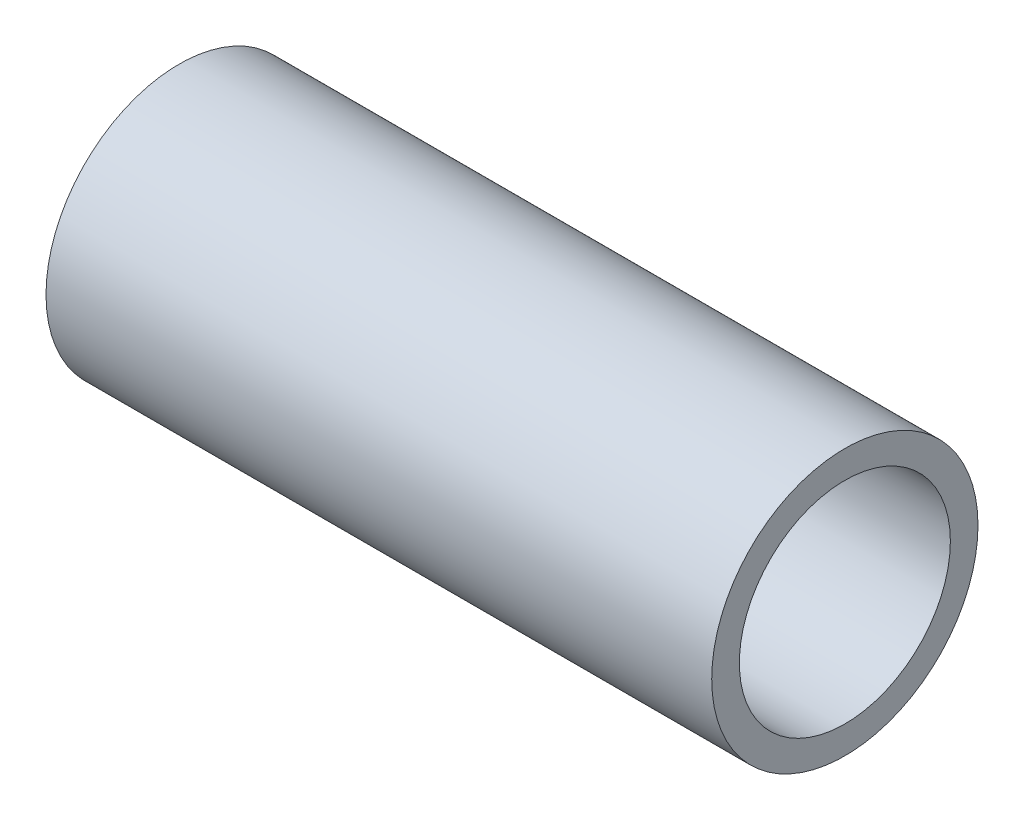
ISO-10303-21;
HEADER;
FILE_DESCRIPTION(('STEP AP214'),'2;1');
FILE_NAME('part.step','',(''),(''),'','','');
FILE_SCHEMA(('AUTOMOTIVE_DESIGN { 1 0 10303 214 1 1 1 1 }'));
ENDSEC;
DATA;
#1=APPLICATION_CONTEXT('core data for automotive mechanical design processes');
#2=APPLICATION_PROTOCOL_DEFINITION('international standard','automotive_design',2000,#1);
#3=PRODUCT_CONTEXT('',#1,'mechanical');
#4=PRODUCT('Part','Part','',(#3));
#5=PRODUCT_RELATED_PRODUCT_CATEGORY('part','',(#4));
#6=PRODUCT_DEFINITION_FORMATION('','',#4);
#7=PRODUCT_DEFINITION_CONTEXT('part definition',#1,'design');
#8=PRODUCT_DEFINITION('design','',#6,#7);
#9=PRODUCT_DEFINITION_SHAPE('','',#8);
#10=(LENGTH_UNIT() NAMED_UNIT(*) SI_UNIT(.MILLI.,.METRE.));
#11=(NAMED_UNIT(*) PLANE_ANGLE_UNIT() SI_UNIT($,.RADIAN.));
#12=(NAMED_UNIT(*) SI_UNIT($,.STERADIAN.) SOLID_ANGLE_UNIT());
#13=UNCERTAINTY_MEASURE_WITH_UNIT(LENGTH_MEASURE(1.E-05),#10,'distance_accuracy_value','');
#14=(GEOMETRIC_REPRESENTATION_CONTEXT(3) GLOBAL_UNCERTAINTY_ASSIGNED_CONTEXT((#13)) GLOBAL_UNIT_ASSIGNED_CONTEXT((#10,
#11,#12)) REPRESENTATION_CONTEXT('',''));
#15=CARTESIAN_POINT('',(0.,0.,0.));
#16=DIRECTION('',(0.,0.,1.));
#17=DIRECTION('',(1.,0.,0.));
#18=AXIS2_PLACEMENT_3D('',#15,#16,#17);
#19=CARTESIAN_POINT('',(20.,0.,0.));
#20=DIRECTION('',(-1.,0.,0.));
#21=DIRECTION('',(0.,0.,1.));
#22=AXIS2_PLACEMENT_3D('',#19,#20,#21);
#23=CYLINDRICAL_SURFACE('',#22,4.);
#24=CARTESIAN_POINT('',(20.,0.,0.));
#25=DIRECTION('',(1.,0.,0.));
#26=DIRECTION('',(0.,0.,-1.));
#27=AXIS2_PLACEMENT_3D('',#24,#25,#26);
#28=CIRCLE('',#27,4.);
#29=CARTESIAN_POINT('',(20.,0.,-4.));
#30=VERTEX_POINT('',#29);
#31=EDGE_CURVE('E10',#30,#30,#28,.T.);
#32=ORIENTED_EDGE('',*,*,#31,.F.);
#33=EDGE_LOOP('',(#32));
#34=FACE_BOUND('',#33,.T.);
#35=CARTESIAN_POINT('',(0.,0.,0.));
#36=DIRECTION('',(1.,0.,0.));
#37=DIRECTION('',(0.,0.,-1.));
#38=AXIS2_PLACEMENT_3D('',#35,#36,#37);
#39=CIRCLE('',#38,4.);
#40=CARTESIAN_POINT('',(0.,0.,-4.));
#41=VERTEX_POINT('',#40);
#42=EDGE_CURVE('E34',#41,#41,#39,.T.);
#43=ORIENTED_EDGE('',*,*,#42,.T.);
#44=EDGE_LOOP('',(#43));
#45=FACE_BOUND('',#44,.T.);
#46=ADVANCED_FACE('F31',(#34,#45),#23,.T.);
#47=CARTESIAN_POINT('',(20.,0.,0.));
#48=DIRECTION('',(1.,0.,0.));
#49=DIRECTION('',(0.,0.,-1.));
#50=AXIS2_PLACEMENT_3D('',#47,#48,#49);
#51=PLANE('',#50);
#52=CARTESIAN_POINT('',(20.,0.,0.));
#53=DIRECTION('',(1.,0.,0.));
#54=DIRECTION('',(0.,0.,-1.));
#55=AXIS2_PLACEMENT_3D('',#52,#53,#54);
#56=CIRCLE('',#55,3.16992);
#57=CARTESIAN_POINT('',(20.,0.,-3.16992));
#58=VERTEX_POINT('',#57);
#59=EDGE_CURVE('E43',#58,#58,#56,.T.);
#60=ORIENTED_EDGE('',*,*,#59,.F.);
#61=EDGE_LOOP('',(#60));
#62=FACE_BOUND('',#61,.T.);
#63=ORIENTED_EDGE('',*,*,#31,.T.);
#64=EDGE_LOOP('',(#63));
#65=FACE_BOUND('',#64,.T.);
#66=ADVANCED_FACE('F58',(#62,#65),#51,.T.);
#67=CARTESIAN_POINT('',(0.,0.,0.));
#68=DIRECTION('',(1.,0.,0.));
#69=DIRECTION('',(0.,0.,-1.));
#70=AXIS2_PLACEMENT_3D('',#67,#68,#69);
#71=PLANE('',#70);
#72=ORIENTED_EDGE('',*,*,#42,.F.);
#73=EDGE_LOOP('',(#72));
#74=FACE_BOUND('',#73,.T.);
#75=ADVANCED_FACE('F54',(#74),#71,.F.);
#76=CARTESIAN_POINT('',(13.65,0.,0.));
#77=DIRECTION('',(1.,0.,0.));
#78=DIRECTION('',(0.,0.,-1.));
#79=AXIS2_PLACEMENT_3D('',#76,#77,#78);
#80=CYLINDRICAL_SURFACE('',#79,3.16992);
#81=CARTESIAN_POINT('',(13.65,0.,0.));
#82=DIRECTION('',(1.,0.,0.));
#83=DIRECTION('',(0.,0.,-1.));
#84=AXIS2_PLACEMENT_3D('',#81,#82,#83);
#85=CIRCLE('',#84,3.16992);
#86=CARTESIAN_POINT('',(13.65,0.,-3.16992));
#87=VERTEX_POINT('',#86);
#88=EDGE_CURVE('E41',#87,#87,#85,.T.);
#89=ORIENTED_EDGE('',*,*,#88,.F.);
#90=EDGE_LOOP('',(#89));
#91=FACE_BOUND('',#90,.T.);
#92=ORIENTED_EDGE('',*,*,#59,.T.);
#93=EDGE_LOOP('',(#92));
#94=FACE_BOUND('',#93,.T.);
#95=ADVANCED_FACE('F51',(#91,#94),#80,.F.);
#96=CARTESIAN_POINT('',(13.65,0.,0.));
#97=DIRECTION('',(1.,0.,0.));
#98=DIRECTION('',(0.,0.,-1.));
#99=AXIS2_PLACEMENT_3D('',#96,#97,#98);
#100=PLANE('',#99);
#101=ORIENTED_EDGE('',*,*,#88,.T.);
#102=EDGE_LOOP('',(#101));
#103=FACE_BOUND('',#102,.T.);
#104=ADVANCED_FACE('F49',(#103),#100,.T.);
#105=CLOSED_SHELL('',(#46,#66,#75,#95,#104));
#106=MANIFOLD_SOLID_BREP('B2',#105);
#107=ADVANCED_BREP_SHAPE_REPRESENTATION('',(#18,#106),#14);
#108=SHAPE_DEFINITION_REPRESENTATION(#9,#107);
ENDSEC;
END-ISO-10303-21;
